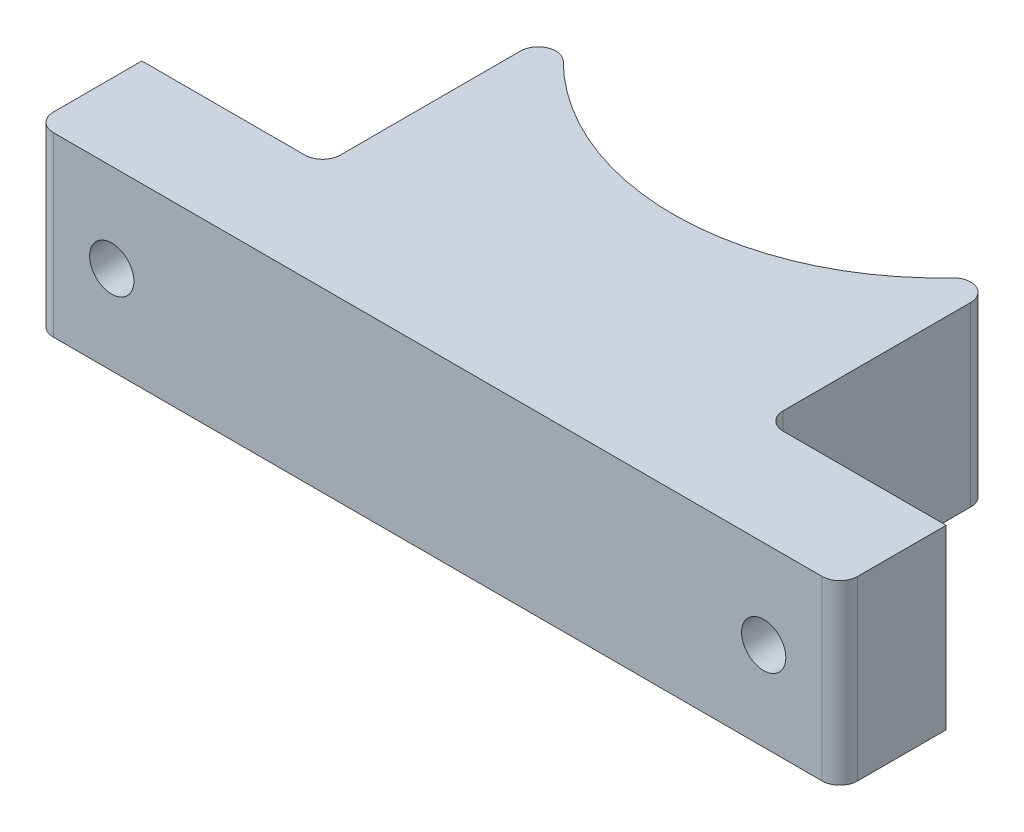
ISO-10303-21;
HEADER;
FILE_DESCRIPTION(('STEP AP214'),'2;1');
FILE_NAME('part.step','',(''),(''),'','','');
FILE_SCHEMA(('AUTOMOTIVE_DESIGN { 1 0 10303 214 1 1 1 1 }'));
ENDSEC;
DATA;
#1=APPLICATION_CONTEXT('core data for automotive mechanical design processes');
#2=APPLICATION_PROTOCOL_DEFINITION('international standard','automotive_design',2000,#1);
#3=PRODUCT_CONTEXT('',#1,'mechanical');
#4=PRODUCT('Part','Part','',(#3));
#5=PRODUCT_RELATED_PRODUCT_CATEGORY('part','',(#4));
#6=PRODUCT_DEFINITION_FORMATION('','',#4);
#7=PRODUCT_DEFINITION_CONTEXT('part definition',#1,'design');
#8=PRODUCT_DEFINITION('design','',#6,#7);
#9=PRODUCT_DEFINITION_SHAPE('','',#8);
#10=(LENGTH_UNIT() NAMED_UNIT(*) SI_UNIT(.MILLI.,.METRE.));
#11=(NAMED_UNIT(*) PLANE_ANGLE_UNIT() SI_UNIT($,.RADIAN.));
#12=(NAMED_UNIT(*) SI_UNIT($,.STERADIAN.) SOLID_ANGLE_UNIT());
#13=UNCERTAINTY_MEASURE_WITH_UNIT(LENGTH_MEASURE(1.E-05),#10,'distance_accuracy_value','');
#14=(GEOMETRIC_REPRESENTATION_CONTEXT(3) GLOBAL_UNCERTAINTY_ASSIGNED_CONTEXT((#13)) GLOBAL_UNIT_ASSIGNED_CONTEXT((#10,
#11,#12)) REPRESENTATION_CONTEXT('',''));
#15=CARTESIAN_POINT('',(0.,0.,0.));
#16=DIRECTION('',(0.,0.,1.));
#17=DIRECTION('',(1.,0.,0.));
#18=AXIS2_PLACEMENT_3D('',#15,#16,#17);
#19=CARTESIAN_POINT('',(-45.,20.,-6.));
#20=DIRECTION('',(1.,0.,0.));
#21=DIRECTION('',(0.,0.,-1.));
#22=AXIS2_PLACEMENT_3D('',#19,#20,#21);
#23=PLANE('',#22);
#24=DIRECTION('',(0.,0.,1.));
#25=VECTOR('',#24,1.);
#26=CARTESIAN_POINT('',(-45.,0.,-6.));
#27=LINE('',#26,#25);
#28=CARTESIAN_POINT('',(-45.,0.,-6.));
#29=VERTEX_POINT('',#28);
#30=CARTESIAN_POINT('',(-45.,0.,3.99999999999999));
#31=VERTEX_POINT('',#30);
#32=EDGE_CURVE('E176',#29,#31,#27,.T.);
#33=ORIENTED_EDGE('',*,*,#32,.T.);
#34=DIRECTION('',(0.,-1.,0.));
#35=VECTOR('',#34,1.);
#36=CARTESIAN_POINT('',(-45.,20.,3.99999999999999));
#37=LINE('',#36,#35);
#38=CARTESIAN_POINT('',(-45.,20.,3.99999999999999));
#39=VERTEX_POINT('',#38);
#40=EDGE_CURVE('E11',#39,#31,#37,.T.);
#41=ORIENTED_EDGE('',*,*,#40,.F.);
#42=DIRECTION('',(0.,0.,1.));
#43=VECTOR('',#42,1.);
#44=CARTESIAN_POINT('',(-45.,20.,-6.));
#45=LINE('',#44,#43);
#46=CARTESIAN_POINT('',(-45.,20.,-6.));
#47=VERTEX_POINT('',#46);
#48=EDGE_CURVE('E217',#47,#39,#45,.T.);
#49=ORIENTED_EDGE('',*,*,#48,.F.);
#50=DIRECTION('',(0.,-1.,0.));
#51=VECTOR('',#50,1.);
#52=CARTESIAN_POINT('',(-45.,20.,-6.));
#53=LINE('',#52,#51);
#54=EDGE_CURVE('E172',#47,#29,#53,.T.);
#55=ORIENTED_EDGE('',*,*,#54,.T.);
#56=EDGE_LOOP('',(#33,#41,#49,#55));
#57=FACE_BOUND('',#56,.T.);
#58=ADVANCED_FACE('F39',(#57),#23,.F.);
#59=CARTESIAN_POINT('',(-43.,20.,4.));
#60=DIRECTION('',(0.,-1.,0.));
#61=DIRECTION('',(0.,0.,-1.));
#62=AXIS2_PLACEMENT_3D('',#59,#60,#61);
#63=CYLINDRICAL_SURFACE('',#62,2.);
#64=CARTESIAN_POINT('',(-43.,0.,4.));
#65=DIRECTION('',(0.,1.,0.));
#66=DIRECTION('',(0.,0.,-1.));
#67=AXIS2_PLACEMENT_3D('',#64,#65,#66);
#68=CIRCLE('',#67,2.);
#69=CARTESIAN_POINT('',(-43.,0.,6.));
#70=VERTEX_POINT('',#69);
#71=EDGE_CURVE('E180',#31,#70,#68,.T.);
#72=ORIENTED_EDGE('',*,*,#71,.T.);
#73=DIRECTION('',(0.,-1.,0.));
#74=VECTOR('',#73,1.);
#75=CARTESIAN_POINT('',(-43.,20.,6.));
#76=LINE('',#75,#74);
#77=CARTESIAN_POINT('',(-43.,20.,6.));
#78=VERTEX_POINT('',#77);
#79=EDGE_CURVE('E48',#78,#70,#76,.T.);
#80=ORIENTED_EDGE('',*,*,#79,.F.);
#81=CARTESIAN_POINT('',(-43.,20.,4.));
#82=DIRECTION('',(0.,1.,0.));
#83=DIRECTION('',(0.,0.,-1.));
#84=AXIS2_PLACEMENT_3D('',#81,#82,#83);
#85=CIRCLE('',#84,2.);
#86=EDGE_CURVE('E117',#39,#78,#85,.T.);
#87=ORIENTED_EDGE('',*,*,#86,.F.);
#88=ORIENTED_EDGE('',*,*,#40,.T.);
#89=EDGE_LOOP('',(#72,#80,#87,#88));
#90=FACE_BOUND('',#89,.T.);
#91=ADVANCED_FACE('F327',(#90),#63,.T.);
#92=CARTESIAN_POINT('',(-43.,20.,6.));
#93=DIRECTION('',(0.,0.,-1.));
#94=DIRECTION('',(-1.,0.,0.));
#95=AXIS2_PLACEMENT_3D('',#92,#93,#94);
#96=PLANE('',#95);
#97=CARTESIAN_POINT('',(-36.4,10.,6.));
#98=DIRECTION('',(0.,0.,1.));
#99=DIRECTION('',(1.,0.,0.));
#100=AXIS2_PLACEMENT_3D('',#97,#98,#99);
#101=CIRCLE('',#100,2.5);
#102=CARTESIAN_POINT('',(-33.9,10.,6.));
#103=VERTEX_POINT('',#102);
#104=EDGE_CURVE('E435',#103,#103,#101,.T.);
#105=ORIENTED_EDGE('',*,*,#104,.F.);
#106=EDGE_LOOP('',(#105));
#107=FACE_BOUND('',#106,.T.);
#108=CARTESIAN_POINT('',(37.2,10.,6.));
#109=DIRECTION('',(0.,0.,1.));
#110=DIRECTION('',(1.,0.,0.));
#111=AXIS2_PLACEMENT_3D('',#108,#109,#110);
#112=CIRCLE('',#111,2.5);
#113=CARTESIAN_POINT('',(39.7,10.,6.));
#114=VERTEX_POINT('',#113);
#115=EDGE_CURVE('E430',#114,#114,#112,.T.);
#116=ORIENTED_EDGE('',*,*,#115,.F.);
#117=EDGE_LOOP('',(#116));
#118=FACE_BOUND('',#117,.T.);
#119=DIRECTION('',(1.,0.,0.));
#120=VECTOR('',#119,1.);
#121=CARTESIAN_POINT('',(-43.,0.,6.));
#122=LINE('',#121,#120);
#123=CARTESIAN_POINT('',(43.8,0.,6.));
#124=VERTEX_POINT('',#123);
#125=EDGE_CURVE('E184',#70,#124,#122,.T.);
#126=ORIENTED_EDGE('',*,*,#125,.T.);
#127=DIRECTION('',(0.,-1.,0.));
#128=VECTOR('',#127,1.);
#129=CARTESIAN_POINT('',(43.8,20.,6.));
#130=LINE('',#129,#128);
#131=CARTESIAN_POINT('',(43.8,20.,6.));
#132=VERTEX_POINT('',#131);
#133=EDGE_CURVE('E252',#132,#124,#130,.T.);
#134=ORIENTED_EDGE('',*,*,#133,.F.);
#135=DIRECTION('',(1.,0.,0.));
#136=VECTOR('',#135,1.);
#137=CARTESIAN_POINT('',(-43.,20.,6.));
#138=LINE('',#137,#136);
#139=EDGE_CURVE('E262',#78,#132,#138,.T.);
#140=ORIENTED_EDGE('',*,*,#139,.F.);
#141=ORIENTED_EDGE('',*,*,#79,.T.);
#142=EDGE_LOOP('',(#126,#134,#140,#141));
#143=FACE_BOUND('',#142,.T.);
#144=ADVANCED_FACE('F260',(#107,#118,#143),#96,.F.);
#145=CARTESIAN_POINT('',(43.8,20.,4.));
#146=DIRECTION('',(0.,-1.,0.));
#147=DIRECTION('',(0.,0.,-1.));
#148=AXIS2_PLACEMENT_3D('',#145,#146,#147);
#149=CYLINDRICAL_SURFACE('',#148,2.);
#150=CARTESIAN_POINT('',(43.8,0.,4.));
#151=DIRECTION('',(0.,1.,0.));
#152=DIRECTION('',(0.,0.,-1.));
#153=AXIS2_PLACEMENT_3D('',#150,#151,#152);
#154=CIRCLE('',#153,2.);
#155=CARTESIAN_POINT('',(45.8,0.,3.99999999999999));
#156=VERTEX_POINT('',#155);
#157=EDGE_CURVE('E187',#124,#156,#154,.T.);
#158=ORIENTED_EDGE('',*,*,#157,.T.);
#159=DIRECTION('',(0.,-1.,0.));
#160=VECTOR('',#159,1.);
#161=CARTESIAN_POINT('',(45.8,20.,3.99999999999999));
#162=LINE('',#161,#160);
#163=CARTESIAN_POINT('',(45.8,20.,3.99999999999999));
#164=VERTEX_POINT('',#163);
#165=EDGE_CURVE('E248',#164,#156,#162,.T.);
#166=ORIENTED_EDGE('',*,*,#165,.F.);
#167=CARTESIAN_POINT('',(43.8,20.,4.));
#168=DIRECTION('',(0.,1.,0.));
#169=DIRECTION('',(0.,0.,-1.));
#170=AXIS2_PLACEMENT_3D('',#167,#168,#169);
#171=CIRCLE('',#170,2.);
#172=EDGE_CURVE('E281',#132,#164,#171,.T.);
#173=ORIENTED_EDGE('',*,*,#172,.F.);
#174=ORIENTED_EDGE('',*,*,#133,.T.);
#175=EDGE_LOOP('',(#158,#166,#173,#174));
#176=FACE_BOUND('',#175,.T.);
#177=ADVANCED_FACE('F271',(#176),#149,.T.);
#178=CARTESIAN_POINT('',(45.8,20.,-6.));
#179=DIRECTION('',(-1.,0.,0.));
#180=DIRECTION('',(0.,0.,1.));
#181=AXIS2_PLACEMENT_3D('',#178,#179,#180);
#182=PLANE('',#181);
#183=DIRECTION('',(0.,0.,-1.));
#184=VECTOR('',#183,1.);
#185=CARTESIAN_POINT('',(45.8,0.,-6.));
#186=LINE('',#185,#184);
#187=CARTESIAN_POINT('',(45.8,0.,-6.));
#188=VERTEX_POINT('',#187);
#189=EDGE_CURVE('E190',#156,#188,#186,.T.);
#190=ORIENTED_EDGE('',*,*,#189,.T.);
#191=DIRECTION('',(0.,-1.,0.));
#192=VECTOR('',#191,1.);
#193=CARTESIAN_POINT('',(45.8,20.,-6.));
#194=LINE('',#193,#192);
#195=CARTESIAN_POINT('',(45.8,20.,-6.));
#196=VERTEX_POINT('',#195);
#197=EDGE_CURVE('E244',#196,#188,#194,.T.);
#198=ORIENTED_EDGE('',*,*,#197,.F.);
#199=DIRECTION('',(0.,0.,-1.));
#200=VECTOR('',#199,1.);
#201=CARTESIAN_POINT('',(45.8,20.,-6.));
#202=LINE('',#201,#200);
#203=EDGE_CURVE('E277',#164,#196,#202,.T.);
#204=ORIENTED_EDGE('',*,*,#203,.F.);
#205=ORIENTED_EDGE('',*,*,#165,.T.);
#206=EDGE_LOOP('',(#190,#198,#204,#205));
#207=FACE_BOUND('',#206,.T.);
#208=ADVANCED_FACE('F275',(#207),#182,.F.);
#209=CARTESIAN_POINT('',(27.4,20.,-6.));
#210=DIRECTION('',(0.,0.,1.));
#211=DIRECTION('',(1.,0.,0.));
#212=AXIS2_PLACEMENT_3D('',#209,#210,#211);
#213=PLANE('',#212);
#214=CARTESIAN_POINT('',(37.2,10.,-6.));
#215=DIRECTION('',(0.,0.,1.));
#216=DIRECTION('',(1.,0.,0.));
#217=AXIS2_PLACEMENT_3D('',#214,#215,#216);
#218=CIRCLE('',#217,2.5);
#219=CARTESIAN_POINT('',(39.7,10.,-6.));
#220=VERTEX_POINT('',#219);
#221=EDGE_CURVE('E433',#220,#220,#218,.F.);
#222=ORIENTED_EDGE('',*,*,#221,.F.);
#223=EDGE_LOOP('',(#222));
#224=FACE_BOUND('',#223,.T.);
#225=DIRECTION('',(-1.,0.,0.));
#226=VECTOR('',#225,1.);
#227=CARTESIAN_POINT('',(27.4,0.,-6.));
#228=LINE('',#227,#226);
#229=CARTESIAN_POINT('',(27.4,0.,-6.));
#230=VERTEX_POINT('',#229);
#231=EDGE_CURVE('E193',#188,#230,#228,.T.);
#232=ORIENTED_EDGE('',*,*,#231,.T.);
#233=DIRECTION('',(0.,-1.,0.));
#234=VECTOR('',#233,1.);
#235=CARTESIAN_POINT('',(27.4,20.,-6.));
#236=LINE('',#235,#234);
#237=CARTESIAN_POINT('',(27.4,20.,-6.));
#238=VERTEX_POINT('',#237);
#239=EDGE_CURVE('E240',#238,#230,#236,.T.);
#240=ORIENTED_EDGE('',*,*,#239,.F.);
#241=DIRECTION('',(-1.,0.,0.));
#242=VECTOR('',#241,1.);
#243=CARTESIAN_POINT('',(27.4,20.,-6.));
#244=LINE('',#243,#242);
#245=EDGE_CURVE('E280',#196,#238,#244,.T.);
#246=ORIENTED_EDGE('',*,*,#245,.F.);
#247=ORIENTED_EDGE('',*,*,#197,.T.);
#248=EDGE_LOOP('',(#232,#240,#246,#247));
#249=FACE_BOUND('',#248,.T.);
#250=ADVANCED_FACE('F341',(#224,#249),#213,.F.);
#251=CARTESIAN_POINT('',(27.4,20.,-8.));
#252=DIRECTION('',(0.,-1.,0.));
#253=DIRECTION('',(0.,0.,-1.));
#254=AXIS2_PLACEMENT_3D('',#251,#252,#253);
#255=CYLINDRICAL_SURFACE('',#254,2.);
#256=CARTESIAN_POINT('',(27.4,0.,-8.));
#257=DIRECTION('',(0.,-1.,0.));
#258=DIRECTION('',(0.,0.,-1.));
#259=AXIS2_PLACEMENT_3D('',#256,#257,#258);
#260=CIRCLE('',#259,2.);
#261=CARTESIAN_POINT('',(25.4,0.,-8.00000000000001));
#262=VERTEX_POINT('',#261);
#263=EDGE_CURVE('E196',#230,#262,#260,.T.);
#264=ORIENTED_EDGE('',*,*,#263,.T.);
#265=DIRECTION('',(0.,-1.,0.));
#266=VECTOR('',#265,1.);
#267=CARTESIAN_POINT('',(25.4,20.,-8.00000000000001));
#268=LINE('',#267,#266);
#269=CARTESIAN_POINT('',(25.4,20.,-8.00000000000001));
#270=VERTEX_POINT('',#269);
#271=EDGE_CURVE('E236',#270,#262,#268,.T.);
#272=ORIENTED_EDGE('',*,*,#271,.F.);
#273=CARTESIAN_POINT('',(27.4,20.,-8.));
#274=DIRECTION('',(0.,-1.,0.));
#275=DIRECTION('',(0.,0.,-1.));
#276=AXIS2_PLACEMENT_3D('',#273,#274,#275);
#277=CIRCLE('',#276,2.);
#278=EDGE_CURVE('E285',#238,#270,#277,.T.);
#279=ORIENTED_EDGE('',*,*,#278,.F.);
#280=ORIENTED_EDGE('',*,*,#239,.T.);
#281=EDGE_LOOP('',(#264,#272,#279,#280));
#282=FACE_BOUND('',#281,.T.);
#283=ADVANCED_FACE('F344',(#282),#255,.F.);
#284=CARTESIAN_POINT('',(25.4,20.,-8.00000000000001));
#285=DIRECTION('',(-1.,0.,0.));
#286=DIRECTION('',(0.,0.,1.));
#287=AXIS2_PLACEMENT_3D('',#284,#285,#286);
#288=PLANE('',#287);
#289=DIRECTION('',(0.,0.,-1.));
#290=VECTOR('',#289,1.);
#291=CARTESIAN_POINT('',(25.4,0.,-8.00000000000001));
#292=LINE('',#291,#290);
#293=CARTESIAN_POINT('',(25.4,0.,-29.1724944164478));
#294=VERTEX_POINT('',#293);
#295=EDGE_CURVE('E199',#262,#294,#292,.T.);
#296=ORIENTED_EDGE('',*,*,#295,.T.);
#297=DIRECTION('',(0.,-1.,0.));
#298=VECTOR('',#297,1.);
#299=CARTESIAN_POINT('',(25.4,20.,-29.1724944164478));
#300=LINE('',#299,#298);
#301=CARTESIAN_POINT('',(25.4,20.,-29.1724944164478));
#302=VERTEX_POINT('',#301);
#303=EDGE_CURVE('E232',#302,#294,#300,.T.);
#304=ORIENTED_EDGE('',*,*,#303,.F.);
#305=DIRECTION('',(0.,0.,-1.));
#306=VECTOR('',#305,1.);
#307=CARTESIAN_POINT('',(25.4,20.,-8.00000000000001));
#308=LINE('',#307,#306);
#309=EDGE_CURVE('E292',#270,#302,#308,.T.);
#310=ORIENTED_EDGE('',*,*,#309,.F.);
#311=ORIENTED_EDGE('',*,*,#271,.T.);
#312=EDGE_LOOP('',(#296,#304,#310,#311));
#313=FACE_BOUND('',#312,.T.);
#314=ADVANCED_FACE('F348',(#313),#288,.F.);
#315=CARTESIAN_POINT('',(23.4,20.,-29.1724944164478));
#316=DIRECTION('',(0.,-1.,0.));
#317=DIRECTION('',(0.,0.,-1.));
#318=AXIS2_PLACEMENT_3D('',#315,#316,#317);
#319=CYLINDRICAL_SURFACE('',#318,2.);
#320=CARTESIAN_POINT('',(23.4,0.,-29.1724944164478));
#321=DIRECTION('',(0.,1.,0.));
#322=DIRECTION('',(0.,0.,1.));
#323=AXIS2_PLACEMENT_3D('',#320,#321,#322);
#324=CIRCLE('',#323,2.);
#325=CARTESIAN_POINT('',(21.9375,0.,-30.5367135154199));
#326=VERTEX_POINT('',#325);
#327=EDGE_CURVE('E202',#294,#326,#324,.T.);
#328=ORIENTED_EDGE('',*,*,#327,.T.);
#329=DIRECTION('',(0.,-1.,0.));
#330=VECTOR('',#329,1.);
#331=CARTESIAN_POINT('',(21.9375,20.,-30.5367135154199));
#332=LINE('',#331,#330);
#333=CARTESIAN_POINT('',(21.9375,20.,-30.5367135154199));
#334=VERTEX_POINT('',#333);
#335=EDGE_CURVE('E228',#334,#326,#332,.T.);
#336=ORIENTED_EDGE('',*,*,#335,.F.);
#337=CARTESIAN_POINT('',(23.4,20.,-29.1724944164478));
#338=DIRECTION('',(0.,1.,0.));
#339=DIRECTION('',(0.,0.,1.));
#340=AXIS2_PLACEMENT_3D('',#337,#338,#339);
#341=CIRCLE('',#340,2.);
#342=EDGE_CURVE('E295',#302,#334,#341,.T.);
#343=ORIENTED_EDGE('',*,*,#342,.F.);
#344=ORIENTED_EDGE('',*,*,#303,.T.);
#345=EDGE_LOOP('',(#328,#336,#343,#344));
#346=FACE_BOUND('',#345,.T.);
#347=ADVANCED_FACE('F352',(#346),#319,.T.);
#348=CARTESIAN_POINT('',(0.,20.,-51.));
#349=DIRECTION('',(0.,-1.,0.));
#350=DIRECTION('',(0.,0.,-1.));
#351=AXIS2_PLACEMENT_3D('',#348,#349,#350);
#352=CYLINDRICAL_SURFACE('',#351,30.);
#353=CARTESIAN_POINT('',(0.,0.,-51.));
#354=DIRECTION('',(0.,-1.,0.));
#355=DIRECTION('',(0.,0.,1.));
#356=AXIS2_PLACEMENT_3D('',#353,#354,#355);
#357=CIRCLE('',#356,30.);
#358=CARTESIAN_POINT('',(-21.1875,0.,-29.7611242352614));
#359=VERTEX_POINT('',#358);
#360=EDGE_CURVE('E205',#326,#359,#357,.T.);
#361=ORIENTED_EDGE('',*,*,#360,.T.);
#362=DIRECTION('',(0.,-1.,0.));
#363=VECTOR('',#362,1.);
#364=CARTESIAN_POINT('',(-21.1875,20.,-29.7611242352614));
#365=LINE('',#364,#363);
#366=CARTESIAN_POINT('',(-21.1875,20.,-29.7611242352614));
#367=VERTEX_POINT('',#366);
#368=EDGE_CURVE('E224',#367,#359,#365,.T.);
#369=ORIENTED_EDGE('',*,*,#368,.F.);
#370=CARTESIAN_POINT('',(0.,20.,-51.));
#371=DIRECTION('',(0.,-1.,0.));
#372=DIRECTION('',(0.,0.,1.));
#373=AXIS2_PLACEMENT_3D('',#370,#371,#372);
#374=CIRCLE('',#373,30.);
#375=EDGE_CURVE('E298',#334,#367,#374,.T.);
#376=ORIENTED_EDGE('',*,*,#375,.F.);
#377=ORIENTED_EDGE('',*,*,#335,.T.);
#378=EDGE_LOOP('',(#361,#369,#376,#377));
#379=FACE_BOUND('',#378,.T.);
#380=ADVANCED_FACE('F306',(#379),#352,.F.);
#381=CARTESIAN_POINT('',(-22.6,20.,-28.3451991842788));
#382=DIRECTION('',(0.,-1.,0.));
#383=DIRECTION('',(0.,0.,-1.));
#384=AXIS2_PLACEMENT_3D('',#381,#382,#383);
#385=CYLINDRICAL_SURFACE('',#384,2.);
#386=CARTESIAN_POINT('',(-22.6,0.,-28.3451991842788));
#387=DIRECTION('',(0.,1.,0.));
#388=DIRECTION('',(0.,0.,-1.));
#389=AXIS2_PLACEMENT_3D('',#386,#387,#388);
#390=CIRCLE('',#389,2.);
#391=CARTESIAN_POINT('',(-24.6,0.,-28.3451991842788));
#392=VERTEX_POINT('',#391);
#393=EDGE_CURVE('E208',#359,#392,#390,.T.);
#394=ORIENTED_EDGE('',*,*,#393,.T.);
#395=DIRECTION('',(0.,-1.,0.));
#396=VECTOR('',#395,1.);
#397=CARTESIAN_POINT('',(-24.6,20.,-28.3451991842788));
#398=LINE('',#397,#396);
#399=CARTESIAN_POINT('',(-24.6,20.,-28.3451991842788));
#400=VERTEX_POINT('',#399);
#401=EDGE_CURVE('E165',#400,#392,#398,.T.);
#402=ORIENTED_EDGE('',*,*,#401,.F.);
#403=CARTESIAN_POINT('',(-22.6,20.,-28.3451991842788));
#404=DIRECTION('',(0.,1.,0.));
#405=DIRECTION('',(0.,0.,-1.));
#406=AXIS2_PLACEMENT_3D('',#403,#404,#405);
#407=CIRCLE('',#406,2.);
#408=EDGE_CURVE('E154',#367,#400,#407,.T.);
#409=ORIENTED_EDGE('',*,*,#408,.F.);
#410=ORIENTED_EDGE('',*,*,#368,.T.);
#411=EDGE_LOOP('',(#394,#402,#409,#410));
#412=FACE_BOUND('',#411,.T.);
#413=ADVANCED_FACE('F310',(#412),#385,.T.);
#414=CARTESIAN_POINT('',(-24.6,20.,-28.3451991842788));
#415=DIRECTION('',(1.,0.,0.));
#416=DIRECTION('',(0.,0.,-1.));
#417=AXIS2_PLACEMENT_3D('',#414,#415,#416);
#418=PLANE('',#417);
#419=DIRECTION('',(0.,0.,1.));
#420=VECTOR('',#419,1.);
#421=CARTESIAN_POINT('',(-24.6,0.,-28.3451991842788));
#422=LINE('',#421,#420);
#423=CARTESIAN_POINT('',(-24.6,0.,-8.00000000000001));
#424=VERTEX_POINT('',#423);
#425=EDGE_CURVE('E163',#392,#424,#422,.T.);
#426=ORIENTED_EDGE('',*,*,#425,.T.);
#427=DIRECTION('',(0.,-1.,0.));
#428=VECTOR('',#427,1.);
#429=CARTESIAN_POINT('',(-24.6,20.,-8.00000000000001));
#430=LINE('',#429,#428);
#431=CARTESIAN_POINT('',(-24.6,20.,-8.00000000000001));
#432=VERTEX_POINT('',#431);
#433=EDGE_CURVE('E160',#432,#424,#430,.T.);
#434=ORIENTED_EDGE('',*,*,#433,.F.);
#435=DIRECTION('',(0.,0.,1.));
#436=VECTOR('',#435,1.);
#437=CARTESIAN_POINT('',(-24.6,20.,-28.3451991842788));
#438=LINE('',#437,#436);
#439=EDGE_CURVE('E148',#400,#432,#438,.T.);
#440=ORIENTED_EDGE('',*,*,#439,.F.);
#441=ORIENTED_EDGE('',*,*,#401,.T.);
#442=EDGE_LOOP('',(#426,#434,#440,#441));
#443=FACE_BOUND('',#442,.T.);
#444=ADVANCED_FACE('F161',(#443),#418,.F.);
#445=CARTESIAN_POINT('',(-26.6,20.,-8.));
#446=DIRECTION('',(0.,-1.,0.));
#447=DIRECTION('',(0.,0.,-1.));
#448=AXIS2_PLACEMENT_3D('',#445,#446,#447);
#449=CYLINDRICAL_SURFACE('',#448,2.);
#450=CARTESIAN_POINT('',(-26.6,0.,-8.));
#451=DIRECTION('',(0.,-1.,0.));
#452=DIRECTION('',(0.,0.,-1.));
#453=AXIS2_PLACEMENT_3D('',#450,#451,#452);
#454=CIRCLE('',#453,2.);
#455=CARTESIAN_POINT('',(-26.6,0.,-6.));
#456=VERTEX_POINT('',#455);
#457=EDGE_CURVE('E103',#424,#456,#454,.T.);
#458=ORIENTED_EDGE('',*,*,#457,.T.);
#459=DIRECTION('',(0.,-1.,0.));
#460=VECTOR('',#459,1.);
#461=CARTESIAN_POINT('',(-26.6,20.,-6.));
#462=LINE('',#461,#460);
#463=CARTESIAN_POINT('',(-26.6,20.,-6.));
#464=VERTEX_POINT('',#463);
#465=EDGE_CURVE('E166',#464,#456,#462,.T.);
#466=ORIENTED_EDGE('',*,*,#465,.F.);
#467=CARTESIAN_POINT('',(-26.6,20.,-8.));
#468=DIRECTION('',(0.,-1.,0.));
#469=DIRECTION('',(0.,0.,-1.));
#470=AXIS2_PLACEMENT_3D('',#467,#468,#469);
#471=CIRCLE('',#470,2.);
#472=EDGE_CURVE('E152',#432,#464,#471,.T.);
#473=ORIENTED_EDGE('',*,*,#472,.F.);
#474=ORIENTED_EDGE('',*,*,#433,.T.);
#475=EDGE_LOOP('',(#458,#466,#473,#474));
#476=FACE_BOUND('',#475,.T.);
#477=ADVANCED_FACE('F168',(#476),#449,.F.);
#478=CARTESIAN_POINT('',(-45.,20.,-6.));
#479=DIRECTION('',(0.,0.,1.));
#480=DIRECTION('',(1.,0.,0.));
#481=AXIS2_PLACEMENT_3D('',#478,#479,#480);
#482=PLANE('',#481);
#483=CARTESIAN_POINT('',(-36.4,10.,-6.));
#484=DIRECTION('',(0.,0.,1.));
#485=DIRECTION('',(1.,0.,0.));
#486=AXIS2_PLACEMENT_3D('',#483,#484,#485);
#487=CIRCLE('',#486,2.5);
#488=CARTESIAN_POINT('',(-33.9,10.,-6.));
#489=VERTEX_POINT('',#488);
#490=EDGE_CURVE('E181',#489,#489,#487,.F.);
#491=ORIENTED_EDGE('',*,*,#490,.F.);
#492=EDGE_LOOP('',(#491));
#493=FACE_BOUND('',#492,.T.);
#494=DIRECTION('',(-1.,0.,0.));
#495=VECTOR('',#494,1.);
#496=CARTESIAN_POINT('',(-45.,0.,-6.));
#497=LINE('',#496,#495);
#498=EDGE_CURVE('E109',#456,#29,#497,.T.);
#499=ORIENTED_EDGE('',*,*,#498,.T.);
#500=ORIENTED_EDGE('',*,*,#54,.F.);
#501=DIRECTION('',(-1.,0.,0.));
#502=VECTOR('',#501,1.);
#503=CARTESIAN_POINT('',(-45.,20.,-6.));
#504=LINE('',#503,#502);
#505=EDGE_CURVE('E56',#464,#47,#504,.T.);
#506=ORIENTED_EDGE('',*,*,#505,.F.);
#507=ORIENTED_EDGE('',*,*,#465,.T.);
#508=EDGE_LOOP('',(#499,#500,#506,#507));
#509=FACE_BOUND('',#508,.T.);
#510=ADVANCED_FACE('F314',(#493,#509),#482,.F.);
#511=CARTESIAN_POINT('',(-43.,20.,4.));
#512=DIRECTION('',(0.,-1.,0.));
#513=DIRECTION('',(0.,0.,-1.));
#514=AXIS2_PLACEMENT_3D('',#511,#512,#513);
#515=PLANE('',#514);
#516=ORIENTED_EDGE('',*,*,#48,.T.);
#517=ORIENTED_EDGE('',*,*,#86,.T.);
#518=ORIENTED_EDGE('',*,*,#139,.T.);
#519=ORIENTED_EDGE('',*,*,#172,.T.);
#520=ORIENTED_EDGE('',*,*,#203,.T.);
#521=ORIENTED_EDGE('',*,*,#245,.T.);
#522=ORIENTED_EDGE('',*,*,#278,.T.);
#523=ORIENTED_EDGE('',*,*,#309,.T.);
#524=ORIENTED_EDGE('',*,*,#342,.T.);
#525=ORIENTED_EDGE('',*,*,#375,.T.);
#526=ORIENTED_EDGE('',*,*,#408,.T.);
#527=ORIENTED_EDGE('',*,*,#439,.T.);
#528=ORIENTED_EDGE('',*,*,#472,.T.);
#529=ORIENTED_EDGE('',*,*,#505,.T.);
#530=EDGE_LOOP('',(#516,#517,#518,#519,#520,#521,#522,#523,#524,#525,#526,#527,#528,#529));
#531=FACE_BOUND('',#530,.T.);
#532=ADVANCED_FACE('F150',(#531),#515,.F.);
#533=CARTESIAN_POINT('',(-43.,0.,4.));
#534=DIRECTION('',(0.,-1.,0.));
#535=DIRECTION('',(0.,0.,-1.));
#536=AXIS2_PLACEMENT_3D('',#533,#534,#535);
#537=PLANE('',#536);
#538=ORIENTED_EDGE('',*,*,#32,.F.);
#539=ORIENTED_EDGE('',*,*,#498,.F.);
#540=ORIENTED_EDGE('',*,*,#457,.F.);
#541=ORIENTED_EDGE('',*,*,#425,.F.);
#542=ORIENTED_EDGE('',*,*,#393,.F.);
#543=ORIENTED_EDGE('',*,*,#360,.F.);
#544=ORIENTED_EDGE('',*,*,#327,.F.);
#545=ORIENTED_EDGE('',*,*,#295,.F.);
#546=ORIENTED_EDGE('',*,*,#263,.F.);
#547=ORIENTED_EDGE('',*,*,#231,.F.);
#548=ORIENTED_EDGE('',*,*,#189,.F.);
#549=ORIENTED_EDGE('',*,*,#157,.F.);
#550=ORIENTED_EDGE('',*,*,#125,.F.);
#551=ORIENTED_EDGE('',*,*,#71,.F.);
#552=EDGE_LOOP('',(#538,#539,#540,#541,#542,#543,#544,#545,#546,#547,#548,#549,#550,#551));
#553=FACE_BOUND('',#552,.T.);
#554=ADVANCED_FACE('F266',(#553),#537,.T.);
#555=CARTESIAN_POINT('',(-36.4,10.,-31.1734944164479));
#556=DIRECTION('',(0.,0.,1.));
#557=DIRECTION('',(1.,0.,0.));
#558=AXIS2_PLACEMENT_3D('',#555,#556,#557);
#559=CYLINDRICAL_SURFACE('',#558,2.5);
#560=ORIENTED_EDGE('',*,*,#104,.T.);
#561=EDGE_LOOP('',(#560));
#562=FACE_BOUND('',#561,.T.);
#563=ORIENTED_EDGE('',*,*,#490,.T.);
#564=EDGE_LOOP('',(#563));
#565=FACE_BOUND('',#564,.T.);
#566=ADVANCED_FACE('F386',(#562,#565),#559,.F.);
#567=CARTESIAN_POINT('',(37.2,10.,-31.1734944164479));
#568=DIRECTION('',(0.,0.,1.));
#569=DIRECTION('',(1.,0.,0.));
#570=AXIS2_PLACEMENT_3D('',#567,#568,#569);
#571=CYLINDRICAL_SURFACE('',#570,2.5);
#572=ORIENTED_EDGE('',*,*,#115,.T.);
#573=EDGE_LOOP('',(#572));
#574=FACE_BOUND('',#573,.T.);
#575=ORIENTED_EDGE('',*,*,#221,.T.);
#576=EDGE_LOOP('',(#575));
#577=FACE_BOUND('',#576,.T.);
#578=ADVANCED_FACE('F413',(#574,#577),#571,.F.);
#579=CLOSED_SHELL('',(#58,#91,#144,#177,#208,#250,#283,#314,#347,#380,#413,#444,#477,#510,#532,
#554,#566,#578));
#580=MANIFOLD_SOLID_BREP('B2',#579);
#581=ADVANCED_BREP_SHAPE_REPRESENTATION('',(#18,#580),#14);
#582=SHAPE_DEFINITION_REPRESENTATION(#9,#581);
ENDSEC;
END-ISO-10303-21;
